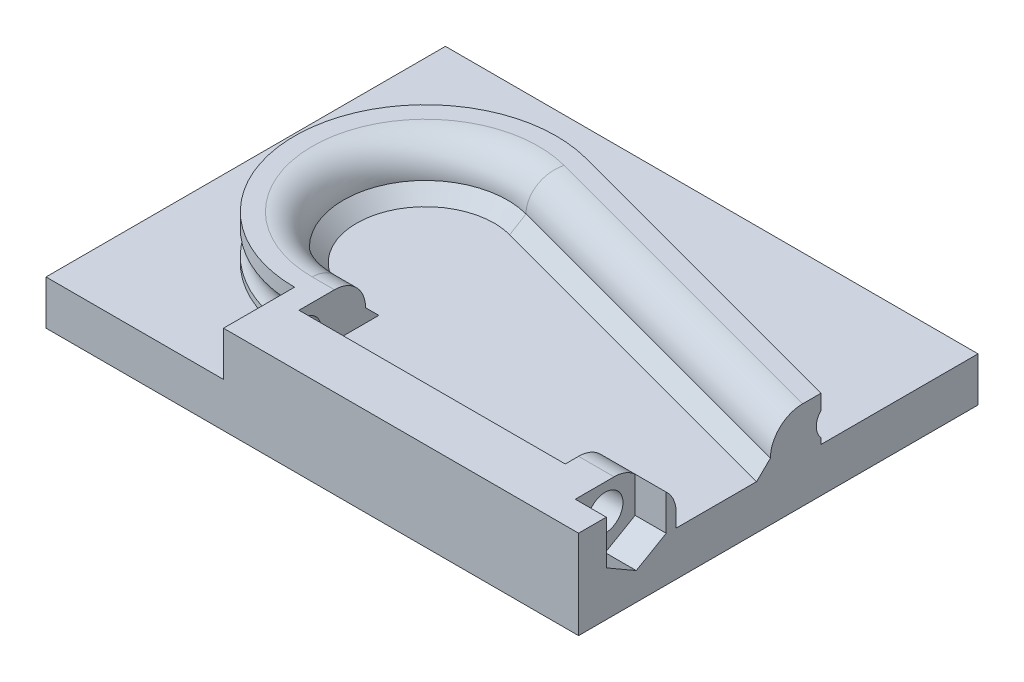
ISO-10303-21;
HEADER;
FILE_DESCRIPTION(('STEP AP214'),'2;1');
FILE_NAME('part.step','',(''),(''),'','','');
FILE_SCHEMA(('AUTOMOTIVE_DESIGN { 1 0 10303 214 1 1 1 1 }'));
ENDSEC;
DATA;
#1=APPLICATION_CONTEXT('core data for automotive mechanical design processes');
#2=APPLICATION_PROTOCOL_DEFINITION('international standard','automotive_design',2000,#1);
#3=PRODUCT_CONTEXT('',#1,'mechanical');
#4=PRODUCT('Part','Part','',(#3));
#5=PRODUCT_RELATED_PRODUCT_CATEGORY('part','',(#4));
#6=PRODUCT_DEFINITION_FORMATION('','',#4);
#7=PRODUCT_DEFINITION_CONTEXT('part definition',#1,'design');
#8=PRODUCT_DEFINITION('design','',#6,#7);
#9=PRODUCT_DEFINITION_SHAPE('','',#8);
#10=(LENGTH_UNIT() NAMED_UNIT(*) SI_UNIT(.MILLI.,.METRE.));
#11=(NAMED_UNIT(*) PLANE_ANGLE_UNIT() SI_UNIT($,.RADIAN.));
#12=(NAMED_UNIT(*) SI_UNIT($,.STERADIAN.) SOLID_ANGLE_UNIT());
#13=UNCERTAINTY_MEASURE_WITH_UNIT(LENGTH_MEASURE(1.E-05),#10,'distance_accuracy_value','');
#14=(GEOMETRIC_REPRESENTATION_CONTEXT(3) GLOBAL_UNCERTAINTY_ASSIGNED_CONTEXT((#13)) GLOBAL_UNIT_ASSIGNED_CONTEXT((#10,
#11,#12)) REPRESENTATION_CONTEXT('',''));
#15=CARTESIAN_POINT('',(0.,0.,0.));
#16=DIRECTION('',(0.,0.,1.));
#17=DIRECTION('',(1.,0.,0.));
#18=AXIS2_PLACEMENT_3D('',#15,#16,#17);
#19=CARTESIAN_POINT('',(60.,20.,-9.60471192760787));
#20=DIRECTION('',(-0.258819045102518,0.,0.965925826289069));
#21=DIRECTION('',(0.965925826289069,0.,0.258819045102518));
#22=AXIS2_PLACEMENT_3D('',#19,#20,#21);
#23=PLANE('',#22);
#24=DIRECTION('',(0.,-1.,0.));
#25=VECTOR('',#24,1.);
#26=CARTESIAN_POINT('',(60.,20.,-9.60471192760787));
#27=LINE('',#26,#25);
#28=CARTESIAN_POINT('',(60.,20.,-9.60471192760787));
#29=VERTEX_POINT('',#28);
#30=CARTESIAN_POINT('',(60.,16.6457513110646,-9.60471192760787));
#31=VERTEX_POINT('',#30);
#32=EDGE_CURVE('E367',#29,#31,#27,.T.);
#33=ORIENTED_EDGE('',*,*,#32,.T.);
#34=DIRECTION('',(-0.965925826289069,0.,-0.258819045102518));
#35=VECTOR('',#34,1.);
#36=CARTESIAN_POINT('',(80.1988867343301,16.6457513110646,-4.19243653913647));
#37=LINE('',#36,#35);
#38=CARTESIAN_POINT('',(59.2235428646925,16.6457513110646,-9.81276298997091));
#39=VERTEX_POINT('',#38);
#40=EDGE_CURVE('E412',#31,#39,#37,.T.);
#41=ORIENTED_EDGE('',*,*,#40,.T.);
#42=DIRECTION('',(-0.965925826289069,0.,-0.258819045102518));
#43=VECTOR('',#42,1.);
#44=CARTESIAN_POINT('',(59.2235428646925,16.6457513110646,-9.81276298997091));
#45=LINE('',#44,#43);
#46=CARTESIAN_POINT('',(-12.3648381694755,16.6457513110647,-28.9948118755276));
#47=VERTEX_POINT('',#46);
#48=EDGE_CURVE('E409',#39,#47,#45,.T.);
#49=ORIENTED_EDGE('',*,*,#48,.T.);
#50=DIRECTION('',(0.,-1.,0.));
#51=VECTOR('',#50,1.);
#52=CARTESIAN_POINT('',(-12.3648381694757,20.,-28.9948118755275));
#53=LINE('',#52,#51);
#54=CARTESIAN_POINT('',(-12.3648381694757,20.,-28.9948118755275));
#55=VERTEX_POINT('',#54);
#56=EDGE_CURVE('E363',#55,#47,#53,.T.);
#57=ORIENTED_EDGE('',*,*,#56,.F.);
#58=DIRECTION('',(-0.965925826289069,0.,-0.258819045102518));
#59=VECTOR('',#58,1.);
#60=CARTESIAN_POINT('',(60.,20.,-9.60471192760787));
#61=LINE('',#60,#59);
#62=EDGE_CURVE('E337',#29,#55,#61,.T.);
#63=ORIENTED_EDGE('',*,*,#62,.F.);
#64=EDGE_LOOP('',(#33,#41,#49,#57,#63));
#65=FACE_BOUND('',#64,.T.);
#66=ADVANCED_FACE('F33',(#65),#23,.F.);
#67=CARTESIAN_POINT('',(-20.,20.,-0.499999999999994));
#68=DIRECTION('',(0.,-1.,0.));
#69=DIRECTION('',(0.,0.,-1.));
#70=AXIS2_PLACEMENT_3D('',#67,#68,#69);
#71=CYLINDRICAL_SURFACE('',#70,29.5);
#72=ORIENTED_EDGE('',*,*,#56,.T.);
#73=CARTESIAN_POINT('',(-19.9999999999991,16.6457513110647,-0.499999999999952));
#74=DIRECTION('',(0.,-1.,0.));
#75=DIRECTION('',(0.,0.,-1.));
#76=AXIS2_PLACEMENT_3D('',#73,#74,#75);
#77=CIRCLE('',#76,29.5);
#78=CARTESIAN_POINT('',(-19.9999999999991,16.6457513110661,29.));
#79=VERTEX_POINT('',#78);
#80=EDGE_CURVE('E329',#47,#79,#77,.F.);
#81=ORIENTED_EDGE('',*,*,#80,.T.);
#82=DIRECTION('',(0.,-1.,0.));
#83=VECTOR('',#82,1.);
#84=CARTESIAN_POINT('',(-20.,20.,29.));
#85=LINE('',#84,#83);
#86=CARTESIAN_POINT('',(-20.,20.,29.));
#87=VERTEX_POINT('',#86);
#88=EDGE_CURVE('E359',#87,#79,#85,.T.);
#89=ORIENTED_EDGE('',*,*,#88,.F.);
#90=CARTESIAN_POINT('',(-20.,20.,-0.499999999999994));
#91=DIRECTION('',(0.,1.,0.));
#92=DIRECTION('',(0.,0.,1.));
#93=AXIS2_PLACEMENT_3D('',#90,#91,#92);
#94=CIRCLE('',#93,29.5);
#95=EDGE_CURVE('E340',#55,#87,#94,.T.);
#96=ORIENTED_EDGE('',*,*,#95,.F.);
#97=EDGE_LOOP('',(#72,#81,#89,#96));
#98=FACE_BOUND('',#97,.T.);
#99=ADVANCED_FACE('F501',(#98),#71,.T.);
#100=CARTESIAN_POINT('',(-20.,20.,45.));
#101=DIRECTION('',(1.,0.,0.));
#102=DIRECTION('',(0.,0.,-1.));
#103=AXIS2_PLACEMENT_3D('',#100,#101,#102);
#104=PLANE('',#103);
#105=ORIENTED_EDGE('',*,*,#88,.T.);
#106=CARTESIAN_POINT('',(-19.9999999999991,14.,31.9999999999987));
#107=DIRECTION('',(1.,0.,0.));
#108=DIRECTION('',(0.,0.,-1.));
#109=AXIS2_PLACEMENT_3D('',#106,#107,#108);
#110=CIRCLE('',#109,4.);
#111=CARTESIAN_POINT('',(-19.9999999999991,9.99999999999999,31.9999999999987));
#112=VERTEX_POINT('',#111);
#113=EDGE_CURVE('E317',#79,#112,#110,.T.);
#114=ORIENTED_EDGE('',*,*,#113,.T.);
#115=DIRECTION('',(0.,0.,1.));
#116=VECTOR('',#115,1.);
#117=CARTESIAN_POINT('',(-20.,10.,45.));
#118=LINE('',#117,#116);
#119=CARTESIAN_POINT('',(-20.,10.,45.));
#120=VERTEX_POINT('',#119);
#121=EDGE_CURVE('E352',#112,#120,#118,.T.);
#122=ORIENTED_EDGE('',*,*,#121,.T.);
#123=DIRECTION('',(0.,-1.,0.));
#124=VECTOR('',#123,1.);
#125=CARTESIAN_POINT('',(-20.,20.,45.));
#126=LINE('',#125,#124);
#127=CARTESIAN_POINT('',(-20.,20.,45.));
#128=VERTEX_POINT('',#127);
#129=EDGE_CURVE('E346',#128,#120,#126,.T.);
#130=ORIENTED_EDGE('',*,*,#129,.F.);
#131=DIRECTION('',(0.,0.,1.));
#132=VECTOR('',#131,1.);
#133=CARTESIAN_POINT('',(-20.,20.,45.));
#134=LINE('',#133,#132);
#135=EDGE_CURVE('E342',#87,#128,#134,.T.);
#136=ORIENTED_EDGE('',*,*,#135,.F.);
#137=EDGE_LOOP('',(#105,#114,#122,#130,#136));
#138=FACE_BOUND('',#137,.T.);
#139=ADVANCED_FACE('F503',(#138),#104,.F.);
#140=CARTESIAN_POINT('',(60.,10.,-45.));
#141=DIRECTION('',(-1.,0.,0.));
#142=DIRECTION('',(0.,0.,1.));
#143=AXIS2_PLACEMENT_3D('',#140,#141,#142);
#144=PLANE('',#143);
#145=CARTESIAN_POINT('',(60.,13.,30.));
#146=DIRECTION('',(-1.,0.,0.));
#147=DIRECTION('',(0.,0.,1.));
#148=AXIS2_PLACEMENT_3D('',#145,#146,#147);
#149=CIRCLE('',#148,7.);
#150=CARTESIAN_POINT('',(60.,13.,23.));
#151=VERTEX_POINT('',#150);
#152=CARTESIAN_POINT('',(60.,18.1417409503008,25.25));
#153=VERTEX_POINT('',#152);
#154=EDGE_CURVE('E471',#151,#153,#149,.F.);
#155=ORIENTED_EDGE('',*,*,#154,.T.);
#156=DIRECTION('',(0.,1.,0.));
#157=VECTOR('',#156,1.);
#158=CARTESIAN_POINT('',(60.,20.,25.25));
#159=LINE('',#158,#157);
#160=CARTESIAN_POINT('',(60.,10.10288568297,25.25));
#161=VERTEX_POINT('',#160);
#162=EDGE_CURVE('E250',#161,#153,#159,.T.);
#163=ORIENTED_EDGE('',*,*,#162,.F.);
#164=DIRECTION('',(0.,0.5,-0.866025403784439));
#165=VECTOR('',#164,1.);
#166=CARTESIAN_POINT('',(60.,6.20577136594005,32.));
#167=LINE('',#166,#165);
#168=CARTESIAN_POINT('',(60.,6.20577136594005,32.));
#169=VERTEX_POINT('',#168);
#170=EDGE_CURVE('E516',#169,#161,#167,.T.);
#171=ORIENTED_EDGE('',*,*,#170,.F.);
#172=DIRECTION('',(0.,-0.5,-0.866025403784439));
#173=VECTOR('',#172,1.);
#174=CARTESIAN_POINT('',(60.,10.10288568297,38.75));
#175=LINE('',#174,#173);
#176=CARTESIAN_POINT('',(60.,10.10288568297,38.75));
#177=VERTEX_POINT('',#176);
#178=EDGE_CURVE('E514',#177,#169,#175,.T.);
#179=ORIENTED_EDGE('',*,*,#178,.F.);
#180=DIRECTION('',(0.,-1.,0.));
#181=VECTOR('',#180,1.);
#182=CARTESIAN_POINT('',(60.,10.10288568297,38.75));
#183=LINE('',#182,#181);
#184=CARTESIAN_POINT('',(60.,20.,38.75));
#185=VERTEX_POINT('',#184);
#186=EDGE_CURVE('E511',#185,#177,#183,.T.);
#187=ORIENTED_EDGE('',*,*,#186,.F.);
#188=DIRECTION('',(0.,0.,-1.));
#189=VECTOR('',#188,1.);
#190=CARTESIAN_POINT('',(60.,20.,45.));
#191=LINE('',#190,#189);
#192=CARTESIAN_POINT('',(60.,20.,45.));
#193=VERTEX_POINT('',#192);
#194=EDGE_CURVE('E265',#193,#185,#191,.T.);
#195=ORIENTED_EDGE('',*,*,#194,.F.);
#196=DIRECTION('',(0.,-1.,0.));
#197=VECTOR('',#196,1.);
#198=CARTESIAN_POINT('',(60.,10.,45.));
#199=LINE('',#198,#197);
#200=CARTESIAN_POINT('',(60.,0.,45.));
#201=VERTEX_POINT('',#200);
#202=EDGE_CURVE('E381',#193,#201,#199,.T.);
#203=ORIENTED_EDGE('',*,*,#202,.T.);
#204=DIRECTION('',(0.,0.,-1.));
#205=VECTOR('',#204,1.);
#206=CARTESIAN_POINT('',(60.,0.,-45.));
#207=LINE('',#206,#205);
#208=CARTESIAN_POINT('',(60.,0.,-45.));
#209=VERTEX_POINT('',#208);
#210=EDGE_CURVE('E370',#201,#209,#207,.T.);
#211=ORIENTED_EDGE('',*,*,#210,.T.);
#212=DIRECTION('',(0.,-1.,0.));
#213=VECTOR('',#212,1.);
#214=CARTESIAN_POINT('',(60.,10.,-45.));
#215=LINE('',#214,#213);
#216=CARTESIAN_POINT('',(60.,10.,-45.));
#217=VERTEX_POINT('',#216);
#218=EDGE_CURVE('E397',#217,#209,#215,.T.);
#219=ORIENTED_EDGE('',*,*,#218,.F.);
#220=DIRECTION('',(0.,0.,-1.));
#221=VECTOR('',#220,1.);
#222=CARTESIAN_POINT('',(60.,10.,-45.));
#223=LINE('',#222,#221);
#224=CARTESIAN_POINT('',(60.,10.,-9.60471192760788));
#225=VERTEX_POINT('',#224);
#226=EDGE_CURVE('E371',#225,#217,#223,.T.);
#227=ORIENTED_EDGE('',*,*,#226,.F.);
#228=CARTESIAN_POINT('',(60.,11.3542486889354,-9.60471192760787));
#229=VERTEX_POINT('',#228);
#230=EDGE_CURVE('E366',#229,#225,#27,.T.);
#231=ORIENTED_EDGE('',*,*,#230,.F.);
#232=CARTESIAN_POINT('',(60.,14.,-12.7105404688381));
#233=DIRECTION('',(-1.,0.,0.));
#234=DIRECTION('',(0.,0.,-1.));
#235=AXIS2_PLACEMENT_3D('',#232,#233,#234);
#236=ELLIPSE('',#235,4.14110472164033,4.);
#237=EDGE_CURVE('E332',#229,#31,#236,.T.);
#238=ORIENTED_EDGE('',*,*,#237,.T.);
#239=ORIENTED_EDGE('',*,*,#32,.F.);
#240=CARTESIAN_POINT('',(60.,20.,-5.46360720596756));
#241=VERTEX_POINT('',#240);
#242=EDGE_CURVE('E338',#241,#29,#191,.T.);
#243=ORIENTED_EDGE('',*,*,#242,.F.);
#244=CARTESIAN_POINT('',(60.,13.,-5.46360720596757));
#245=DIRECTION('',(-1.,0.,0.));
#246=DIRECTION('',(0.,0.,1.));
#247=AXIS2_PLACEMENT_3D('',#244,#245,#246);
#248=ELLIPSE('',#247,7.24693326287057,7.);
#249=CARTESIAN_POINT('',(60.,13.,1.78332605690301));
#250=VERTEX_POINT('',#249);
#251=EDGE_CURVE('E469',#241,#250,#248,.F.);
#252=ORIENTED_EDGE('',*,*,#251,.T.);
#253=DIRECTION('',(0.,-0.694746590606866,0.719254596676404));
#254=VECTOR('',#253,1.);
#255=CARTESIAN_POINT('',(60.,34.929594529251,-20.9198608052818));
#256=LINE('',#255,#254);
#257=CARTESIAN_POINT('',(60.,10.,4.88915459813327));
#258=VERTEX_POINT('',#257);
#259=EDGE_CURVE('E448',#250,#258,#256,.T.);
#260=ORIENTED_EDGE('',*,*,#259,.T.);
#261=DIRECTION('',(0.,0.,-1.));
#262=VECTOR('',#261,1.);
#263=CARTESIAN_POINT('',(60.,10.,23.));
#264=LINE('',#263,#262);
#265=CARTESIAN_POINT('',(60.,10.,23.));
#266=VERTEX_POINT('',#265);
#267=EDGE_CURVE('E292',#266,#258,#264,.T.);
#268=ORIENTED_EDGE('',*,*,#267,.F.);
#269=DIRECTION('',(0.,1.,0.));
#270=VECTOR('',#269,1.);
#271=CARTESIAN_POINT('',(60.,10.,23.));
#272=LINE('',#271,#270);
#273=EDGE_CURVE('E304',#266,#151,#272,.T.);
#274=ORIENTED_EDGE('',*,*,#273,.T.);
#275=EDGE_LOOP('',(#155,#163,#171,#179,#187,#195,#203,#211,#219,#227,#231,#238,#239,#243,#252,
#260,#268,#274));
#276=FACE_BOUND('',#275,.T.);
#277=ADVANCED_FACE('F490',(#276),#144,.F.);
#278=CARTESIAN_POINT('',(-60.,10.,-45.));
#279=DIRECTION('',(0.,0.,1.));
#280=DIRECTION('',(1.,0.,0.));
#281=AXIS2_PLACEMENT_3D('',#278,#279,#280);
#282=PLANE('',#281);
#283=DIRECTION('',(-1.,0.,0.));
#284=VECTOR('',#283,1.);
#285=CARTESIAN_POINT('',(-60.,0.,-45.));
#286=LINE('',#285,#284);
#287=CARTESIAN_POINT('',(-60.,0.,-45.));
#288=VERTEX_POINT('',#287);
#289=EDGE_CURVE('E384',#209,#288,#286,.T.);
#290=ORIENTED_EDGE('',*,*,#289,.T.);
#291=DIRECTION('',(0.,-1.,0.));
#292=VECTOR('',#291,1.);
#293=CARTESIAN_POINT('',(-60.,10.,-45.));
#294=LINE('',#293,#292);
#295=CARTESIAN_POINT('',(-60.,10.,-45.));
#296=VERTEX_POINT('',#295);
#297=EDGE_CURVE('E394',#296,#288,#294,.T.);
#298=ORIENTED_EDGE('',*,*,#297,.F.);
#299=DIRECTION('',(-1.,0.,0.));
#300=VECTOR('',#299,1.);
#301=CARTESIAN_POINT('',(-60.,10.,-45.));
#302=LINE('',#301,#300);
#303=EDGE_CURVE('E373',#217,#296,#302,.T.);
#304=ORIENTED_EDGE('',*,*,#303,.F.);
#305=ORIENTED_EDGE('',*,*,#218,.T.);
#306=EDGE_LOOP('',(#290,#298,#304,#305));
#307=FACE_BOUND('',#306,.T.);
#308=ADVANCED_FACE('F637',(#307),#282,.F.);
#309=CARTESIAN_POINT('',(-60.,10.,-45.));
#310=DIRECTION('',(1.,0.,0.));
#311=DIRECTION('',(0.,0.,-1.));
#312=AXIS2_PLACEMENT_3D('',#309,#310,#311);
#313=PLANE('',#312);
#314=DIRECTION('',(0.,0.,1.));
#315=VECTOR('',#314,1.);
#316=CARTESIAN_POINT('',(-60.,0.,-45.));
#317=LINE('',#316,#315);
#318=CARTESIAN_POINT('',(-60.,0.,45.));
#319=VERTEX_POINT('',#318);
#320=EDGE_CURVE('E386',#288,#319,#317,.T.);
#321=ORIENTED_EDGE('',*,*,#320,.T.);
#322=DIRECTION('',(0.,-1.,0.));
#323=VECTOR('',#322,1.);
#324=CARTESIAN_POINT('',(-60.,10.,45.));
#325=LINE('',#324,#323);
#326=CARTESIAN_POINT('',(-60.,10.,45.));
#327=VERTEX_POINT('',#326);
#328=EDGE_CURVE('E391',#327,#319,#325,.T.);
#329=ORIENTED_EDGE('',*,*,#328,.F.);
#330=DIRECTION('',(0.,0.,1.));
#331=VECTOR('',#330,1.);
#332=CARTESIAN_POINT('',(-60.,10.,-45.));
#333=LINE('',#332,#331);
#334=EDGE_CURVE('E376',#296,#327,#333,.T.);
#335=ORIENTED_EDGE('',*,*,#334,.F.);
#336=ORIENTED_EDGE('',*,*,#297,.T.);
#337=EDGE_LOOP('',(#321,#329,#335,#336));
#338=FACE_BOUND('',#337,.T.);
#339=ADVANCED_FACE('F639',(#338),#313,.F.);
#340=CARTESIAN_POINT('',(-60.,10.,45.));
#341=DIRECTION('',(0.,0.,-1.));
#342=DIRECTION('',(-1.,0.,0.));
#343=AXIS2_PLACEMENT_3D('',#340,#341,#342);
#344=PLANE('',#343);
#345=DIRECTION('',(1.,0.,0.));
#346=VECTOR('',#345,1.);
#347=CARTESIAN_POINT('',(-60.,0.,45.));
#348=LINE('',#347,#346);
#349=EDGE_CURVE('E374',#319,#201,#348,.T.);
#350=ORIENTED_EDGE('',*,*,#349,.T.);
#351=ORIENTED_EDGE('',*,*,#202,.F.);
#352=DIRECTION('',(1.,0.,0.));
#353=VECTOR('',#352,1.);
#354=CARTESIAN_POINT('',(60.,20.,45.));
#355=LINE('',#354,#353);
#356=EDGE_CURVE('E344',#128,#193,#355,.T.);
#357=ORIENTED_EDGE('',*,*,#356,.F.);
#358=ORIENTED_EDGE('',*,*,#129,.T.);
#359=DIRECTION('',(1.,0.,0.));
#360=VECTOR('',#359,1.);
#361=CARTESIAN_POINT('',(-60.,10.,45.));
#362=LINE('',#361,#360);
#363=EDGE_CURVE('E378',#327,#120,#362,.T.);
#364=ORIENTED_EDGE('',*,*,#363,.F.);
#365=ORIENTED_EDGE('',*,*,#328,.T.);
#366=EDGE_LOOP('',(#350,#351,#357,#358,#364,#365));
#367=FACE_BOUND('',#366,.T.);
#368=ADVANCED_FACE('F508',(#367),#344,.F.);
#369=CARTESIAN_POINT('',(0.,10.,0.));
#370=DIRECTION('',(0.,1.,0.));
#371=DIRECTION('',(0.,0.,1.));
#372=AXIS2_PLACEMENT_3D('',#369,#370,#371);
#373=PLANE('',#372);
#374=ORIENTED_EDGE('',*,*,#226,.T.);
#375=ORIENTED_EDGE('',*,*,#303,.T.);
#376=ORIENTED_EDGE('',*,*,#334,.T.);
#377=ORIENTED_EDGE('',*,*,#363,.T.);
#378=ORIENTED_EDGE('',*,*,#121,.F.);
#379=CARTESIAN_POINT('',(-20.,10.,29.));
#380=VERTEX_POINT('',#379);
#381=EDGE_CURVE('E353',#380,#112,#118,.T.);
#382=ORIENTED_EDGE('',*,*,#381,.F.);
#383=CARTESIAN_POINT('',(-20.,10.,-0.499999999999994));
#384=DIRECTION('',(0.,1.,0.));
#385=DIRECTION('',(0.,0.,1.));
#386=AXIS2_PLACEMENT_3D('',#383,#384,#385);
#387=CIRCLE('',#386,29.5);
#388=CARTESIAN_POINT('',(-12.3648381694757,10.,-28.9948118755275));
#389=VERTEX_POINT('',#388);
#390=EDGE_CURVE('E349',#389,#380,#387,.T.);
#391=ORIENTED_EDGE('',*,*,#390,.F.);
#392=DIRECTION('',(-0.965925826289069,0.,-0.258819045102518));
#393=VECTOR('',#392,1.);
#394=CARTESIAN_POINT('',(60.,10.,-9.60471192760787));
#395=LINE('',#394,#393);
#396=EDGE_CURVE('E335',#225,#389,#395,.T.);
#397=ORIENTED_EDGE('',*,*,#396,.F.);
#398=EDGE_LOOP('',(#374,#375,#376,#377,#378,#382,#391,#397));
#399=FACE_BOUND('',#398,.T.);
#400=ADVANCED_FACE('F612',(#399),#373,.T.);
#401=CARTESIAN_POINT('',(0.,0.,0.));
#402=DIRECTION('',(0.,1.,0.));
#403=DIRECTION('',(0.,0.,1.));
#404=AXIS2_PLACEMENT_3D('',#401,#402,#403);
#405=PLANE('',#404);
#406=ORIENTED_EDGE('',*,*,#210,.F.);
#407=ORIENTED_EDGE('',*,*,#349,.F.);
#408=ORIENTED_EDGE('',*,*,#320,.F.);
#409=ORIENTED_EDGE('',*,*,#289,.F.);
#410=EDGE_LOOP('',(#406,#407,#408,#409));
#411=FACE_BOUND('',#410,.T.);
#412=ADVANCED_FACE('F604',(#411),#405,.F.);
#413=DIRECTION('',(-0.965925826289069,0.,-0.258819045102518));
#414=VECTOR('',#413,1.);
#415=CARTESIAN_POINT('',(59.2235428646925,11.3542486889354,-9.81276298997091));
#416=LINE('',#415,#414);
#417=CARTESIAN_POINT('',(-12.3648381694755,11.3542486889353,-28.9948118755276));
#418=VERTEX_POINT('',#417);
#419=CARTESIAN_POINT('',(59.2235428646925,11.3542486889354,-9.81276298997091));
#420=VERTEX_POINT('',#419);
#421=EDGE_CURVE('E403',#418,#420,#416,.F.);
#422=ORIENTED_EDGE('',*,*,#421,.T.);
#423=DIRECTION('',(-0.965925826289069,0.,-0.258819045102518));
#424=VECTOR('',#423,1.);
#425=CARTESIAN_POINT('',(80.1988867343301,11.3542486889354,-4.19243653913647));
#426=LINE('',#425,#424);
#427=EDGE_CURVE('E406',#420,#229,#426,.F.);
#428=ORIENTED_EDGE('',*,*,#427,.T.);
#429=ORIENTED_EDGE('',*,*,#230,.T.);
#430=ORIENTED_EDGE('',*,*,#396,.T.);
#431=EDGE_CURVE('E362',#418,#389,#53,.T.);
#432=ORIENTED_EDGE('',*,*,#431,.F.);
#433=EDGE_LOOP('',(#422,#428,#429,#430,#432));
#434=FACE_BOUND('',#433,.T.);
#435=ADVANCED_FACE('F596',(#434),#23,.F.);
#436=CARTESIAN_POINT('',(-20.,11.3542486889339,29.));
#437=VERTEX_POINT('',#436);
#438=EDGE_CURVE('E358',#437,#380,#85,.T.);
#439=ORIENTED_EDGE('',*,*,#438,.F.);
#440=CARTESIAN_POINT('',(-19.9999999999991,11.3542486889353,-0.499999999999952));
#441=DIRECTION('',(0.,1.,0.));
#442=DIRECTION('',(0.,0.,1.));
#443=AXIS2_PLACEMENT_3D('',#440,#441,#442);
#444=CIRCLE('',#443,29.5);
#445=EDGE_CURVE('E320',#437,#418,#444,.F.);
#446=ORIENTED_EDGE('',*,*,#445,.T.);
#447=ORIENTED_EDGE('',*,*,#431,.T.);
#448=ORIENTED_EDGE('',*,*,#390,.T.);
#449=EDGE_LOOP('',(#439,#446,#447,#448));
#450=FACE_BOUND('',#449,.T.);
#451=ADVANCED_FACE('F601',(#450),#71,.T.);
#452=ORIENTED_EDGE('',*,*,#381,.T.);
#453=CARTESIAN_POINT('',(-20.,14.,31.9999999999987));
#454=DIRECTION('',(1.,0.,0.));
#455=DIRECTION('',(0.,0.,-1.));
#456=AXIS2_PLACEMENT_3D('',#453,#454,#455);
#457=CIRCLE('',#456,4.);
#458=EDGE_CURVE('E400',#112,#437,#457,.T.);
#459=ORIENTED_EDGE('',*,*,#458,.T.);
#460=ORIENTED_EDGE('',*,*,#438,.T.);
#461=EDGE_LOOP('',(#452,#459,#460));
#462=FACE_BOUND('',#461,.T.);
#463=ADVANCED_FACE('F610',(#462),#104,.F.);
#464=CARTESIAN_POINT('',(-20.,20.,-0.499999999999994));
#465=DIRECTION('',(0.,1.,0.));
#466=DIRECTION('',(0.,0.,1.));
#467=AXIS2_PLACEMENT_3D('',#464,#465,#466);
#468=PLANE('',#467);
#469=DIRECTION('',(1.,0.,0.));
#470=VECTOR('',#469,1.);
#471=CARTESIAN_POINT('',(53.,20.,38.75));
#472=LINE('',#471,#470);
#473=CARTESIAN_POINT('',(53.,20.,38.75));
#474=VERTEX_POINT('',#473);
#475=EDGE_CURVE('E255',#474,#185,#472,.T.);
#476=ORIENTED_EDGE('',*,*,#475,.F.);
#477=DIRECTION('',(0.,0.,1.));
#478=VECTOR('',#477,1.);
#479=CARTESIAN_POINT('',(53.,20.,38.75));
#480=LINE('',#479,#478);
#481=CARTESIAN_POINT('',(53.,20.,30.));
#482=VERTEX_POINT('',#481);
#483=EDGE_CURVE('E240',#482,#474,#480,.T.);
#484=ORIENTED_EDGE('',*,*,#483,.F.);
#485=DIRECTION('',(1.,0.,0.));
#486=VECTOR('',#485,1.);
#487=CARTESIAN_POINT('',(45.,20.,30.));
#488=LINE('',#487,#486);
#489=CARTESIAN_POINT('',(45.,20.,30.));
#490=VERTEX_POINT('',#489);
#491=EDGE_CURVE('E464',#482,#490,#488,.F.);
#492=ORIENTED_EDGE('',*,*,#491,.T.);
#493=DIRECTION('',(0.,0.,-1.));
#494=VECTOR('',#493,1.);
#495=CARTESIAN_POINT('',(45.,20.,33.));
#496=LINE('',#495,#494);
#497=CARTESIAN_POINT('',(45.,20.,33.));
#498=VERTEX_POINT('',#497);
#499=EDGE_CURVE('E302',#498,#490,#496,.T.);
#500=ORIENTED_EDGE('',*,*,#499,.F.);
#501=DIRECTION('',(1.,0.,0.));
#502=VECTOR('',#501,1.);
#503=CARTESIAN_POINT('',(-15.,20.,33.));
#504=LINE('',#503,#502);
#505=CARTESIAN_POINT('',(-15.,20.,33.));
#506=VERTEX_POINT('',#505);
#507=EDGE_CURVE('E298',#506,#498,#504,.T.);
#508=ORIENTED_EDGE('',*,*,#507,.F.);
#509=DIRECTION('',(0.,0.,1.));
#510=VECTOR('',#509,1.);
#511=CARTESIAN_POINT('',(-15.,20.,18.));
#512=LINE('',#511,#510);
#513=CARTESIAN_POINT('',(-15.,20.,25.));
#514=VERTEX_POINT('',#513);
#515=EDGE_CURVE('E296',#514,#506,#512,.T.);
#516=ORIENTED_EDGE('',*,*,#515,.F.);
#517=DIRECTION('',(1.,0.,0.));
#518=VECTOR('',#517,1.);
#519=CARTESIAN_POINT('',(-20.,20.,25.));
#520=LINE('',#519,#518);
#521=CARTESIAN_POINT('',(-20.,20.,25.));
#522=VERTEX_POINT('',#521);
#523=EDGE_CURVE('E462',#514,#522,#520,.F.);
#524=ORIENTED_EDGE('',*,*,#523,.T.);
#525=CARTESIAN_POINT('',(-20.,20.,-0.499999999999994));
#526=DIRECTION('',(0.,1.,0.));
#527=DIRECTION('',(0.,0.,1.));
#528=AXIS2_PLACEMENT_3D('',#525,#526,#527);
#529=CIRCLE('',#528,25.5);
#530=CARTESIAN_POINT('',(-13.4001143498858,20.,-25.1311085703713));
#531=VERTEX_POINT('',#530);
#532=EDGE_CURVE('E460',#522,#531,#529,.F.);
#533=ORIENTED_EDGE('',*,*,#532,.T.);
#534=DIRECTION('',(-0.965925826289069,0.,-0.258819045102518));
#535=VECTOR('',#534,1.);
#536=CARTESIAN_POINT('',(61.8117333157177,20.,-4.97815472712047));
#537=LINE('',#536,#535);
#538=EDGE_CURVE('E458',#531,#241,#537,.F.);
#539=ORIENTED_EDGE('',*,*,#538,.T.);
#540=ORIENTED_EDGE('',*,*,#242,.T.);
#541=ORIENTED_EDGE('',*,*,#62,.T.);
#542=ORIENTED_EDGE('',*,*,#95,.T.);
#543=ORIENTED_EDGE('',*,*,#135,.T.);
#544=ORIENTED_EDGE('',*,*,#356,.T.);
#545=ORIENTED_EDGE('',*,*,#194,.T.);
#546=EDGE_LOOP('',(#476,#484,#492,#500,#508,#516,#524,#533,#539,#540,#541,#542,#543,#544,#545));
#547=FACE_BOUND('',#546,.T.);
#548=ADVANCED_FACE('F262',(#547),#468,.T.);
#549=CARTESIAN_POINT('',(80.9753438696376,14.,-7.09021401800369));
#550=DIRECTION('',(-0.965925826289069,0.,-0.258819045102518));
#551=DIRECTION('',(-0.258819045102518,0.,0.965925826289069));
#552=AXIS2_PLACEMENT_3D('',#549,#550,#551);
#553=CYLINDRICAL_SURFACE('',#552,4.);
#554=ORIENTED_EDGE('',*,*,#237,.F.);
#555=ORIENTED_EDGE('',*,*,#427,.F.);
#556=CARTESIAN_POINT('',(60.,14.,-12.7105404688381));
#557=DIRECTION('',(-0.965925826289069,0.,-0.258819045102519));
#558=DIRECTION('',(-0.258819045102519,0.,0.965925826289069));
#559=AXIS2_PLACEMENT_3D('',#556,#557,#558);
#560=CIRCLE('',#559,4.);
#561=EDGE_CURVE('E307',#420,#39,#560,.T.);
#562=ORIENTED_EDGE('',*,*,#561,.T.);
#563=ORIENTED_EDGE('',*,*,#40,.F.);
#564=EDGE_LOOP('',(#554,#555,#562,#563));
#565=FACE_BOUND('',#564,.T.);
#566=ADVANCED_FACE('F809',(#565),#553,.F.);
#567=CARTESIAN_POINT('',(60.,14.,-12.7105404688381));
#568=DIRECTION('',(-0.965925826289069,0.,-0.258819045102518));
#569=DIRECTION('',(-0.258819045102518,0.,0.965925826289069));
#570=AXIS2_PLACEMENT_3D('',#567,#568,#569);
#571=CYLINDRICAL_SURFACE('',#570,4.);
#572=ORIENTED_EDGE('',*,*,#561,.F.);
#573=ORIENTED_EDGE('',*,*,#421,.F.);
#574=CARTESIAN_POINT('',(-11.588381034168,14.,-31.8925893543947));
#575=DIRECTION('',(-0.965925826289069,0.,-0.258819045102519));
#576=DIRECTION('',(-0.258819045102519,0.,0.965925826289069));
#577=AXIS2_PLACEMENT_3D('',#574,#575,#576);
#578=CIRCLE('',#577,4.);
#579=EDGE_CURVE('E322',#418,#47,#578,.T.);
#580=ORIENTED_EDGE('',*,*,#579,.T.);
#581=ORIENTED_EDGE('',*,*,#48,.F.);
#582=EDGE_LOOP('',(#572,#573,#580,#581));
#583=FACE_BOUND('',#582,.T.);
#584=ADVANCED_FACE('F619',(#583),#571,.F.);
#585=CARTESIAN_POINT('',(-19.9999999999991,14.,-0.499999999999952));
#586=DIRECTION('',(0.,1.,0.));
#587=DIRECTION('',(0.,0.,1.));
#588=AXIS2_PLACEMENT_3D('',#585,#586,#587);
#589=TOROIDAL_SURFACE('',#588,32.4999999999999,4.);
#590=ORIENTED_EDGE('',*,*,#579,.F.);
#591=ORIENTED_EDGE('',*,*,#445,.F.);
#592=EDGE_CURVE('E321',#437,#79,#110,.T.);
#593=ORIENTED_EDGE('',*,*,#592,.T.);
#594=ORIENTED_EDGE('',*,*,#80,.F.);
#595=EDGE_LOOP('',(#590,#591,#593,#594));
#596=FACE_BOUND('',#595,.T.);
#597=ADVANCED_FACE('F589',(#596),#589,.F.);
#598=CARTESIAN_POINT('',(-19.9999999999991,14.,31.9999999999987));
#599=DIRECTION('',(1.,0.,0.));
#600=DIRECTION('',(0.,0.,-1.));
#601=AXIS2_PLACEMENT_3D('',#598,#599,#600);
#602=CYLINDRICAL_SURFACE('',#601,4.);
#603=CARTESIAN_POINT('',(53.,14.,31.9999999999987));
#604=DIRECTION('',(-1.,0.,0.));
#605=DIRECTION('',(0.,0.,1.));
#606=AXIS2_PLACEMENT_3D('',#603,#604,#605);
#607=CIRCLE('',#606,4.);
#608=CARTESIAN_POINT('',(53.,14.,35.9999999999987));
#609=VERTEX_POINT('',#608);
#610=EDGE_CURVE('E273',#609,#609,#607,.F.);
#611=ORIENTED_EDGE('',*,*,#610,.T.);
#612=EDGE_LOOP('',(#611));
#613=FACE_BOUND('',#612,.T.);
#614=DIRECTION('',(1.,0.,0.));
#615=VECTOR('',#614,1.);
#616=CARTESIAN_POINT('',(-19.9999999999991,10.1270166537929,33.));
#617=LINE('',#616,#615);
#618=CARTESIAN_POINT('',(45.,10.1270166537929,33.));
#619=VERTEX_POINT('',#618);
#620=CARTESIAN_POINT('',(-15.,10.1270166537929,33.));
#621=VERTEX_POINT('',#620);
#622=EDGE_CURVE('E426',#619,#621,#617,.F.);
#623=ORIENTED_EDGE('',*,*,#622,.T.);
#624=CARTESIAN_POINT('',(-15.,14.,31.9999999999987));
#625=DIRECTION('',(-1.,0.,0.));
#626=DIRECTION('',(0.,0.,1.));
#627=AXIS2_PLACEMENT_3D('',#624,#625,#626);
#628=CIRCLE('',#627,4.);
#629=CARTESIAN_POINT('',(-15.,10.,31.9999999999987));
#630=VERTEX_POINT('',#629);
#631=EDGE_CURVE('E419',#621,#630,#628,.F.);
#632=ORIENTED_EDGE('',*,*,#631,.T.);
#633=CARTESIAN_POINT('',(-15.,17.8729833462071,33.));
#634=VERTEX_POINT('',#633);
#635=EDGE_CURVE('E415',#630,#634,#628,.F.);
#636=ORIENTED_EDGE('',*,*,#635,.T.);
#637=DIRECTION('',(1.,0.,0.));
#638=VECTOR('',#637,1.);
#639=CARTESIAN_POINT('',(-19.9999999999991,17.8729833462071,33.));
#640=LINE('',#639,#638);
#641=CARTESIAN_POINT('',(45.,17.8729833462071,33.));
#642=VERTEX_POINT('',#641);
#643=EDGE_CURVE('E418',#634,#642,#640,.T.);
#644=ORIENTED_EDGE('',*,*,#643,.T.);
#645=CARTESIAN_POINT('',(45.,14.,31.9999999999987));
#646=DIRECTION('',(1.,0.,0.));
#647=DIRECTION('',(0.,0.,-1.));
#648=AXIS2_PLACEMENT_3D('',#645,#646,#647);
#649=CIRCLE('',#648,4.);
#650=CARTESIAN_POINT('',(45.,10.,31.9999999999987));
#651=VERTEX_POINT('',#650);
#652=EDGE_CURVE('E422',#642,#651,#649,.F.);
#653=ORIENTED_EDGE('',*,*,#652,.T.);
#654=EDGE_CURVE('E425',#651,#619,#649,.F.);
#655=ORIENTED_EDGE('',*,*,#654,.T.);
#656=EDGE_LOOP('',(#623,#632,#636,#644,#653,#655));
#657=FACE_BOUND('',#656,.T.);
#658=ORIENTED_EDGE('',*,*,#113,.F.);
#659=ORIENTED_EDGE('',*,*,#592,.F.);
#660=ORIENTED_EDGE('',*,*,#458,.F.);
#661=EDGE_LOOP('',(#658,#659,#660));
#662=FACE_BOUND('',#661,.T.);
#663=ADVANCED_FACE('F572',(#613,#657,#662),#602,.F.);
#664=CARTESIAN_POINT('',(45.,10.,33.));
#665=DIRECTION('',(1.,0.,0.));
#666=DIRECTION('',(0.,0.,-1.));
#667=AXIS2_PLACEMENT_3D('',#664,#665,#666);
#668=PLANE('',#667);
#669=DIRECTION('',(0.,0.,-1.));
#670=VECTOR('',#669,1.);
#671=CARTESIAN_POINT('',(45.,10.,33.));
#672=LINE('',#671,#670);
#673=CARTESIAN_POINT('',(45.,10.,33.));
#674=VERTEX_POINT('',#673);
#675=EDGE_CURVE('E286',#674,#651,#672,.T.);
#676=ORIENTED_EDGE('',*,*,#675,.F.);
#677=DIRECTION('',(0.,1.,0.));
#678=VECTOR('',#677,1.);
#679=CARTESIAN_POINT('',(45.,10.,33.));
#680=LINE('',#679,#678);
#681=EDGE_CURVE('E310',#674,#619,#680,.T.);
#682=ORIENTED_EDGE('',*,*,#681,.T.);
#683=ORIENTED_EDGE('',*,*,#654,.F.);
#684=EDGE_LOOP('',(#676,#682,#683));
#685=FACE_BOUND('',#684,.T.);
#686=ADVANCED_FACE('F582',(#685),#668,.F.);
#687=ORIENTED_EDGE('',*,*,#499,.T.);
#688=CARTESIAN_POINT('',(45.,13.,30.));
#689=DIRECTION('',(1.,0.,0.));
#690=DIRECTION('',(0.,0.,-1.));
#691=AXIS2_PLACEMENT_3D('',#688,#689,#690);
#692=CIRCLE('',#691,7.);
#693=CARTESIAN_POINT('',(45.,13.,23.));
#694=VERTEX_POINT('',#693);
#695=EDGE_CURVE('E55',#490,#694,#692,.F.);
#696=ORIENTED_EDGE('',*,*,#695,.T.);
#697=DIRECTION('',(0.,1.,0.));
#698=VECTOR('',#697,1.);
#699=CARTESIAN_POINT('',(45.,10.,23.));
#700=LINE('',#699,#698);
#701=CARTESIAN_POINT('',(45.,10.,23.));
#702=VERTEX_POINT('',#701);
#703=EDGE_CURVE('E308',#702,#694,#700,.T.);
#704=ORIENTED_EDGE('',*,*,#703,.F.);
#705=EDGE_CURVE('E285',#651,#702,#672,.T.);
#706=ORIENTED_EDGE('',*,*,#705,.F.);
#707=ORIENTED_EDGE('',*,*,#652,.F.);
#708=EDGE_CURVE('E313',#642,#498,#680,.T.);
#709=ORIENTED_EDGE('',*,*,#708,.T.);
#710=EDGE_LOOP('',(#687,#696,#704,#706,#707,#709));
#711=FACE_BOUND('',#710,.T.);
#712=ADVANCED_FACE('F536',(#711),#668,.F.);
#713=CARTESIAN_POINT('',(-15.,10.,33.));
#714=DIRECTION('',(0.,0.,1.));
#715=DIRECTION('',(1.,0.,0.));
#716=AXIS2_PLACEMENT_3D('',#713,#714,#715);
#717=PLANE('',#716);
#718=ORIENTED_EDGE('',*,*,#681,.F.);
#719=DIRECTION('',(1.,0.,0.));
#720=VECTOR('',#719,1.);
#721=CARTESIAN_POINT('',(-15.,10.,33.));
#722=LINE('',#721,#720);
#723=CARTESIAN_POINT('',(-15.,10.,33.));
#724=VERTEX_POINT('',#723);
#725=EDGE_CURVE('E281',#724,#674,#722,.T.);
#726=ORIENTED_EDGE('',*,*,#725,.F.);
#727=DIRECTION('',(0.,1.,0.));
#728=VECTOR('',#727,1.);
#729=CARTESIAN_POINT('',(-15.,10.,33.));
#730=LINE('',#729,#728);
#731=EDGE_CURVE('E314',#724,#621,#730,.T.);
#732=ORIENTED_EDGE('',*,*,#731,.T.);
#733=ORIENTED_EDGE('',*,*,#622,.F.);
#734=EDGE_LOOP('',(#718,#726,#732,#733));
#735=FACE_BOUND('',#734,.T.);
#736=ADVANCED_FACE('F581',(#735),#717,.F.);
#737=EDGE_CURVE('E295',#634,#506,#730,.T.);
#738=ORIENTED_EDGE('',*,*,#737,.T.);
#739=ORIENTED_EDGE('',*,*,#507,.T.);
#740=ORIENTED_EDGE('',*,*,#708,.F.);
#741=ORIENTED_EDGE('',*,*,#643,.F.);
#742=EDGE_LOOP('',(#738,#739,#740,#741));
#743=FACE_BOUND('',#742,.T.);
#744=ADVANCED_FACE('F542',(#743),#717,.F.);
#745=CARTESIAN_POINT('',(-15.,10.,18.));
#746=DIRECTION('',(-1.,0.,0.));
#747=DIRECTION('',(0.,0.,1.));
#748=AXIS2_PLACEMENT_3D('',#745,#746,#747);
#749=PLANE('',#748);
#750=ORIENTED_EDGE('',*,*,#731,.F.);
#751=DIRECTION('',(0.,0.,1.));
#752=VECTOR('',#751,1.);
#753=CARTESIAN_POINT('',(-15.,10.,18.));
#754=LINE('',#753,#752);
#755=EDGE_CURVE('E282',#630,#724,#754,.T.);
#756=ORIENTED_EDGE('',*,*,#755,.F.);
#757=ORIENTED_EDGE('',*,*,#631,.F.);
#758=EDGE_LOOP('',(#750,#756,#757));
#759=FACE_BOUND('',#758,.T.);
#760=ADVANCED_FACE('F579',(#759),#749,.F.);
#761=DIRECTION('',(0.,0.707106781186547,0.707106781186548));
#762=VECTOR('',#761,1.);
#763=CARTESIAN_POINT('',(-15.,11.5,16.5));
#764=LINE('',#763,#762);
#765=CARTESIAN_POINT('',(-15.,10.,15.));
#766=VERTEX_POINT('',#765);
#767=CARTESIAN_POINT('',(-15.,13.,18.));
#768=VERTEX_POINT('',#767);
#769=EDGE_CURVE('E445',#766,#768,#764,.T.);
#770=ORIENTED_EDGE('',*,*,#769,.T.);
#771=CARTESIAN_POINT('',(-15.,13.,25.));
#772=DIRECTION('',(-1.,0.,0.));
#773=DIRECTION('',(0.,0.,1.));
#774=AXIS2_PLACEMENT_3D('',#771,#772,#773);
#775=CIRCLE('',#774,7.);
#776=EDGE_CURVE('E450',#768,#514,#775,.F.);
#777=ORIENTED_EDGE('',*,*,#776,.T.);
#778=ORIENTED_EDGE('',*,*,#515,.T.);
#779=ORIENTED_EDGE('',*,*,#737,.F.);
#780=ORIENTED_EDGE('',*,*,#635,.F.);
#781=EDGE_CURVE('E278',#766,#630,#754,.T.);
#782=ORIENTED_EDGE('',*,*,#781,.F.);
#783=EDGE_LOOP('',(#770,#777,#778,#779,#780,#782));
#784=FACE_BOUND('',#783,.T.);
#785=ADVANCED_FACE('F576',(#784),#749,.F.);
#786=CARTESIAN_POINT('',(-20.,10.,-0.499999999999994));
#787=DIRECTION('',(0.,1.,0.));
#788=DIRECTION('',(0.,0.,1.));
#789=AXIS2_PLACEMENT_3D('',#786,#787,#788);
#790=PLANE('',#789);
#791=DIRECTION('',(1.,0.,0.));
#792=VECTOR('',#791,1.);
#793=CARTESIAN_POINT('',(-20.,10.,15.));
#794=LINE('',#793,#792);
#795=CARTESIAN_POINT('',(-20.,10.,15.));
#796=VERTEX_POINT('',#795);
#797=EDGE_CURVE('E433',#796,#766,#794,.T.);
#798=ORIENTED_EDGE('',*,*,#797,.T.);
#799=ORIENTED_EDGE('',*,*,#781,.T.);
#800=ORIENTED_EDGE('',*,*,#755,.T.);
#801=ORIENTED_EDGE('',*,*,#725,.T.);
#802=ORIENTED_EDGE('',*,*,#675,.T.);
#803=ORIENTED_EDGE('',*,*,#705,.T.);
#804=DIRECTION('',(1.,0.,0.));
#805=VECTOR('',#804,1.);
#806=CARTESIAN_POINT('',(45.,10.,23.));
#807=LINE('',#806,#805);
#808=EDGE_CURVE('E289',#702,#266,#807,.T.);
#809=ORIENTED_EDGE('',*,*,#808,.T.);
#810=ORIENTED_EDGE('',*,*,#267,.T.);
#811=DIRECTION('',(-0.965925826289069,0.,-0.258819045102518));
#812=VECTOR('',#811,1.);
#813=CARTESIAN_POINT('',(-15.988304800911,10.,-15.4718503074806));
#814=LINE('',#813,#812);
#815=CARTESIAN_POINT('',(-15.988304800911,10.,-15.4718503074806));
#816=VERTEX_POINT('',#815);
#817=EDGE_CURVE('E431',#258,#816,#814,.T.);
#818=ORIENTED_EDGE('',*,*,#817,.T.);
#819=CARTESIAN_POINT('',(-20.,10.,-0.499999999999994));
#820=DIRECTION('',(0.,1.,0.));
#821=DIRECTION('',(0.,0.,1.));
#822=AXIS2_PLACEMENT_3D('',#819,#820,#821);
#823=CIRCLE('',#822,15.5);
#824=EDGE_CURVE('E429',#816,#796,#823,.T.);
#825=ORIENTED_EDGE('',*,*,#824,.T.);
#826=EDGE_LOOP('',(#798,#799,#800,#801,#802,#803,#809,#810,#818,#825));
#827=FACE_BOUND('',#826,.T.);
#828=ADVANCED_FACE('F563',(#827),#790,.T.);
#829=CARTESIAN_POINT('',(45.,10.,23.));
#830=DIRECTION('',(0.,0.,1.));
#831=DIRECTION('',(1.,0.,0.));
#832=AXIS2_PLACEMENT_3D('',#829,#830,#831);
#833=PLANE('',#832);
#834=ORIENTED_EDGE('',*,*,#703,.T.);
#835=DIRECTION('',(1.,0.,0.));
#836=VECTOR('',#835,1.);
#837=CARTESIAN_POINT('',(60.,13.,23.));
#838=LINE('',#837,#836);
#839=EDGE_CURVE('E466',#694,#151,#838,.T.);
#840=ORIENTED_EDGE('',*,*,#839,.T.);
#841=ORIENTED_EDGE('',*,*,#273,.F.);
#842=ORIENTED_EDGE('',*,*,#808,.F.);
#843=EDGE_LOOP('',(#834,#840,#841,#842));
#844=FACE_BOUND('',#843,.T.);
#845=ADVANCED_FACE('F566',(#844),#833,.F.);
#846=CARTESIAN_POINT('',(-15.988304800911,10.,-15.4718503074806));
#847=DIRECTION('',(0.183012701892217,-0.707106781186548,-0.68301270189222));
#848=DIRECTION('',(-0.965925826289069,0.,-0.258819045102518));
#849=AXIS2_PLACEMENT_3D('',#846,#847,#848);
#850=PLANE('',#849);
#851=ORIENTED_EDGE('',*,*,#259,.F.);
#852=DIRECTION('',(0.965925826289069,0.,0.258819045102518));
#853=VECTOR('',#852,1.);
#854=CARTESIAN_POINT('',(-15.2118476656034,13.,-18.3696277863478));
#855=LINE('',#854,#853);
#856=CARTESIAN_POINT('',(-15.2118476656034,13.,-18.3696277863478));
#857=VERTEX_POINT('',#856);
#858=EDGE_CURVE('E439',#857,#250,#855,.T.);
#859=ORIENTED_EDGE('',*,*,#858,.F.);
#860=DIRECTION('',(0.183012701892217,0.707106781186547,-0.683012701892221));
#861=VECTOR('',#860,1.);
#862=CARTESIAN_POINT('',(-15.988304800911,10.,-15.4718503074806));
#863=LINE('',#862,#861);
#864=EDGE_CURVE('E299',#816,#857,#863,.T.);
#865=ORIENTED_EDGE('',*,*,#864,.F.);
#866=ORIENTED_EDGE('',*,*,#817,.F.);
#867=EDGE_LOOP('',(#851,#859,#865,#866));
#868=FACE_BOUND('',#867,.T.);
#869=ADVANCED_FACE('F560',(#868),#850,.F.);
#870=CARTESIAN_POINT('',(-20.,10.,-0.499999999999994));
#871=DIRECTION('',(0.,1.,0.));
#872=DIRECTION('',(0.,0.,1.));
#873=AXIS2_PLACEMENT_3D('',#870,#871,#872);
#874=CONICAL_SURFACE('',#873,15.5,0.785398163397449);
#875=ORIENTED_EDGE('',*,*,#864,.T.);
#876=CARTESIAN_POINT('',(-20.,13.,-0.499999999999994));
#877=DIRECTION('',(0.,1.,0.));
#878=DIRECTION('',(0.,0.,1.));
#879=AXIS2_PLACEMENT_3D('',#876,#877,#878);
#880=CIRCLE('',#879,18.5);
#881=CARTESIAN_POINT('',(-20.,13.,18.));
#882=VERTEX_POINT('',#881);
#883=EDGE_CURVE('E442',#882,#857,#880,.F.);
#884=ORIENTED_EDGE('',*,*,#883,.F.);
#885=DIRECTION('',(0.,0.707106781186547,0.707106781186548));
#886=VECTOR('',#885,1.);
#887=CARTESIAN_POINT('',(-20.,10.,15.));
#888=LINE('',#887,#886);
#889=EDGE_CURVE('E451',#796,#882,#888,.T.);
#890=ORIENTED_EDGE('',*,*,#889,.F.);
#891=ORIENTED_EDGE('',*,*,#824,.F.);
#892=EDGE_LOOP('',(#875,#884,#890,#891));
#893=FACE_BOUND('',#892,.T.);
#894=ADVANCED_FACE('F556',(#893),#874,.F.);
#895=CARTESIAN_POINT('',(-20.,10.,15.));
#896=DIRECTION('',(0.,-0.707106781186548,0.707106781186547));
#897=DIRECTION('',(1.,0.,0.));
#898=AXIS2_PLACEMENT_3D('',#895,#896,#897);
#899=PLANE('',#898);
#900=ORIENTED_EDGE('',*,*,#889,.T.);
#901=DIRECTION('',(-1.,0.,0.));
#902=VECTOR('',#901,1.);
#903=CARTESIAN_POINT('',(-20.,13.,18.));
#904=LINE('',#903,#902);
#905=EDGE_CURVE('E436',#768,#882,#904,.T.);
#906=ORIENTED_EDGE('',*,*,#905,.F.);
#907=ORIENTED_EDGE('',*,*,#769,.F.);
#908=ORIENTED_EDGE('',*,*,#797,.F.);
#909=EDGE_LOOP('',(#900,#906,#907,#908));
#910=FACE_BOUND('',#909,.T.);
#911=ADVANCED_FACE('F551',(#910),#899,.F.);
#912=CARTESIAN_POINT('',(-13.4001143498858,13.,-25.1311085703713));
#913=DIRECTION('',(0.965925826289069,0.,0.258819045102518));
#914=DIRECTION('',(0.258819045102518,0.,-0.965925826289069));
#915=AXIS2_PLACEMENT_3D('',#912,#913,#914);
#916=CYLINDRICAL_SURFACE('',#915,7.);
#917=ORIENTED_EDGE('',*,*,#251,.F.);
#918=ORIENTED_EDGE('',*,*,#538,.F.);
#919=CARTESIAN_POINT('',(-13.4001143498858,13.,-25.1311085703713));
#920=DIRECTION('',(-0.965925826289069,0.,-0.258819045102518));
#921=DIRECTION('',(-0.258819045102518,0.,0.965925826289069));
#922=AXIS2_PLACEMENT_3D('',#919,#920,#921);
#923=CIRCLE('',#922,7.);
#924=EDGE_CURVE('E454',#857,#531,#923,.T.);
#925=ORIENTED_EDGE('',*,*,#924,.F.);
#926=ORIENTED_EDGE('',*,*,#858,.T.);
#927=EDGE_LOOP('',(#917,#918,#925,#926));
#928=FACE_BOUND('',#927,.T.);
#929=ADVANCED_FACE('F486',(#928),#916,.T.);
#930=CARTESIAN_POINT('',(-20.,13.,-0.499999999999994));
#931=DIRECTION('',(0.,1.,0.));
#932=DIRECTION('',(0.,0.,1.));
#933=AXIS2_PLACEMENT_3D('',#930,#931,#932);
#934=TOROIDAL_SURFACE('',#933,25.5,7.);
#935=ORIENTED_EDGE('',*,*,#924,.T.);
#936=ORIENTED_EDGE('',*,*,#532,.F.);
#937=CARTESIAN_POINT('',(-20.,13.,25.));
#938=DIRECTION('',(1.,0.,0.));
#939=DIRECTION('',(0.,1.,0.));
#940=AXIS2_PLACEMENT_3D('',#937,#938,#939);
#941=CIRCLE('',#940,7.);
#942=EDGE_CURVE('E276',#882,#522,#941,.T.);
#943=ORIENTED_EDGE('',*,*,#942,.F.);
#944=ORIENTED_EDGE('',*,*,#883,.T.);
#945=EDGE_LOOP('',(#935,#936,#943,#944));
#946=FACE_BOUND('',#945,.T.);
#947=ADVANCED_FACE('F481',(#946),#934,.T.);
#948=CARTESIAN_POINT('',(-20.,13.,25.));
#949=DIRECTION('',(-1.,0.,0.));
#950=DIRECTION('',(0.,0.,1.));
#951=AXIS2_PLACEMENT_3D('',#948,#949,#950);
#952=CYLINDRICAL_SURFACE('',#951,7.);
#953=ORIENTED_EDGE('',*,*,#942,.T.);
#954=ORIENTED_EDGE('',*,*,#523,.F.);
#955=ORIENTED_EDGE('',*,*,#776,.F.);
#956=ORIENTED_EDGE('',*,*,#905,.T.);
#957=EDGE_LOOP('',(#953,#954,#955,#956));
#958=FACE_BOUND('',#957,.T.);
#959=ADVANCED_FACE('F547',(#958),#952,.T.);
#960=CARTESIAN_POINT('',(45.,13.,30.));
#961=DIRECTION('',(-1.,0.,0.));
#962=DIRECTION('',(0.,0.,1.));
#963=AXIS2_PLACEMENT_3D('',#960,#961,#962);
#964=CYLINDRICAL_SURFACE('',#963,7.);
#965=DIRECTION('',(-1.,0.,0.));
#966=VECTOR('',#965,1.);
#967=CARTESIAN_POINT('',(45.,18.1417409503008,25.25));
#968=LINE('',#967,#966);
#969=CARTESIAN_POINT('',(53.,18.1417409503008,25.25));
#970=VERTEX_POINT('',#969);
#971=EDGE_CURVE('E11',#153,#970,#968,.T.);
#972=ORIENTED_EDGE('',*,*,#971,.F.);
#973=ORIENTED_EDGE('',*,*,#154,.F.);
#974=ORIENTED_EDGE('',*,*,#839,.F.);
#975=ORIENTED_EDGE('',*,*,#695,.F.);
#976=ORIENTED_EDGE('',*,*,#491,.F.);
#977=CARTESIAN_POINT('',(53.,13.,30.));
#978=DIRECTION('',(-1.,0.,0.));
#979=DIRECTION('',(0.,0.,1.));
#980=AXIS2_PLACEMENT_3D('',#977,#978,#979);
#981=CIRCLE('',#980,7.);
#982=EDGE_CURVE('E41',#970,#482,#981,.F.);
#983=ORIENTED_EDGE('',*,*,#982,.F.);
#984=EDGE_LOOP('',(#972,#973,#974,#975,#976,#983));
#985=FACE_BOUND('',#984,.T.);
#986=ADVANCED_FACE('F35',(#985),#964,.T.);
#987=CARTESIAN_POINT('',(53.,0.,0.));
#988=DIRECTION('',(-1.,0.,0.));
#989=DIRECTION('',(0.,0.,1.));
#990=AXIS2_PLACEMENT_3D('',#987,#988,#989);
#991=PLANE('',#990);
#992=ORIENTED_EDGE('',*,*,#982,.T.);
#993=ORIENTED_EDGE('',*,*,#483,.T.);
#994=DIRECTION('',(0.,-1.,0.));
#995=VECTOR('',#994,1.);
#996=CARTESIAN_POINT('',(53.,10.10288568297,38.75));
#997=LINE('',#996,#995);
#998=CARTESIAN_POINT('',(53.,10.10288568297,38.75));
#999=VERTEX_POINT('',#998);
#1000=EDGE_CURVE('E245',#474,#999,#997,.T.);
#1001=ORIENTED_EDGE('',*,*,#1000,.T.);
#1002=DIRECTION('',(0.,-0.5,-0.866025403784439));
#1003=VECTOR('',#1002,1.);
#1004=CARTESIAN_POINT('',(53.,10.10288568297,38.75));
#1005=LINE('',#1004,#1003);
#1006=CARTESIAN_POINT('',(53.,6.20577136594005,32.));
#1007=VERTEX_POINT('',#1006);
#1008=EDGE_CURVE('E259',#999,#1007,#1005,.T.);
#1009=ORIENTED_EDGE('',*,*,#1008,.T.);
#1010=DIRECTION('',(0.,0.5,-0.866025403784439));
#1011=VECTOR('',#1010,1.);
#1012=CARTESIAN_POINT('',(53.,6.20577136594005,32.));
#1013=LINE('',#1012,#1011);
#1014=CARTESIAN_POINT('',(53.,10.10288568297,25.25));
#1015=VERTEX_POINT('',#1014);
#1016=EDGE_CURVE('E269',#1007,#1015,#1013,.T.);
#1017=ORIENTED_EDGE('',*,*,#1016,.T.);
#1018=DIRECTION('',(0.,1.,0.));
#1019=VECTOR('',#1018,1.);
#1020=CARTESIAN_POINT('',(53.,20.,25.25));
#1021=LINE('',#1020,#1019);
#1022=EDGE_CURVE('E48',#1015,#970,#1021,.T.);
#1023=ORIENTED_EDGE('',*,*,#1022,.T.);
#1024=EDGE_LOOP('',(#992,#993,#1001,#1009,#1017,#1023));
#1025=FACE_BOUND('',#1024,.T.);
#1026=ORIENTED_EDGE('',*,*,#610,.F.);
#1027=EDGE_LOOP('',(#1026));
#1028=FACE_BOUND('',#1027,.T.);
#1029=ADVANCED_FACE('F242',(#1025,#1028),#991,.F.);
#1030=CARTESIAN_POINT('',(53.,20.,25.25));
#1031=DIRECTION('',(0.,0.,-1.));
#1032=DIRECTION('',(-1.,0.,0.));
#1033=AXIS2_PLACEMENT_3D('',#1030,#1031,#1032);
#1034=PLANE('',#1033);
#1035=ORIENTED_EDGE('',*,*,#971,.T.);
#1036=ORIENTED_EDGE('',*,*,#1022,.F.);
#1037=DIRECTION('',(1.,0.,0.));
#1038=VECTOR('',#1037,1.);
#1039=CARTESIAN_POINT('',(53.,10.10288568297,25.25));
#1040=LINE('',#1039,#1038);
#1041=EDGE_CURVE('E277',#1015,#161,#1040,.T.);
#1042=ORIENTED_EDGE('',*,*,#1041,.T.);
#1043=ORIENTED_EDGE('',*,*,#162,.T.);
#1044=EDGE_LOOP('',(#1035,#1036,#1042,#1043));
#1045=FACE_BOUND('',#1044,.T.);
#1046=ADVANCED_FACE('F531',(#1045),#1034,.F.);
#1047=CARTESIAN_POINT('',(53.,6.20577136594005,32.));
#1048=DIRECTION('',(0.,-0.866025403784439,-0.5));
#1049=DIRECTION('',(0.,0.5,-0.866025403784439));
#1050=AXIS2_PLACEMENT_3D('',#1047,#1048,#1049);
#1051=PLANE('',#1050);
#1052=ORIENTED_EDGE('',*,*,#170,.T.);
#1053=ORIENTED_EDGE('',*,*,#1041,.F.);
#1054=ORIENTED_EDGE('',*,*,#1016,.F.);
#1055=DIRECTION('',(1.,0.,0.));
#1056=VECTOR('',#1055,1.);
#1057=CARTESIAN_POINT('',(53.,6.20577136594005,32.));
#1058=LINE('',#1057,#1056);
#1059=EDGE_CURVE('E267',#1007,#169,#1058,.T.);
#1060=ORIENTED_EDGE('',*,*,#1059,.T.);
#1061=EDGE_LOOP('',(#1052,#1053,#1054,#1060));
#1062=FACE_BOUND('',#1061,.T.);
#1063=ADVANCED_FACE('F525',(#1062),#1051,.F.);
#1064=CARTESIAN_POINT('',(53.,10.10288568297,38.75));
#1065=DIRECTION('',(0.,-0.866025403784439,0.5));
#1066=DIRECTION('',(0.,-0.5,-0.866025403784439));
#1067=AXIS2_PLACEMENT_3D('',#1064,#1065,#1066);
#1068=PLANE('',#1067);
#1069=ORIENTED_EDGE('',*,*,#178,.T.);
#1070=ORIENTED_EDGE('',*,*,#1059,.F.);
#1071=ORIENTED_EDGE('',*,*,#1008,.F.);
#1072=DIRECTION('',(1.,0.,0.));
#1073=VECTOR('',#1072,1.);
#1074=CARTESIAN_POINT('',(53.,10.10288568297,38.75));
#1075=LINE('',#1074,#1073);
#1076=EDGE_CURVE('E257',#999,#177,#1075,.T.);
#1077=ORIENTED_EDGE('',*,*,#1076,.T.);
#1078=EDGE_LOOP('',(#1069,#1070,#1071,#1077));
#1079=FACE_BOUND('',#1078,.T.);
#1080=ADVANCED_FACE('F528',(#1079),#1068,.F.);
#1081=CARTESIAN_POINT('',(53.,10.10288568297,38.75));
#1082=DIRECTION('',(0.,0.,1.));
#1083=DIRECTION('',(1.,0.,0.));
#1084=AXIS2_PLACEMENT_3D('',#1081,#1082,#1083);
#1085=PLANE('',#1084);
#1086=ORIENTED_EDGE('',*,*,#186,.T.);
#1087=ORIENTED_EDGE('',*,*,#1076,.F.);
#1088=ORIENTED_EDGE('',*,*,#1000,.F.);
#1089=ORIENTED_EDGE('',*,*,#475,.T.);
#1090=EDGE_LOOP('',(#1086,#1087,#1088,#1089));
#1091=FACE_BOUND('',#1090,.T.);
#1092=ADVANCED_FACE('F254',(#1091),#1085,.F.);
#1093=CLOSED_SHELL('',(#66,#99,#139,#277,#308,#339,#368,#400,#412,#435,#451,#463,#548,#566,#584,
#597,#663,#686,#712,#736,#744,#760,#785,#828,#845,#869,#894,#911,#929,#947,#959,#986,#1029,
#1046,#1063,#1080,#1092));
#1094=MANIFOLD_SOLID_BREP('B2',#1093);
#1095=ADVANCED_BREP_SHAPE_REPRESENTATION('',(#18,#1094),#14);
#1096=SHAPE_DEFINITION_REPRESENTATION(#9,#1095);
ENDSEC;
END-ISO-10303-21;
